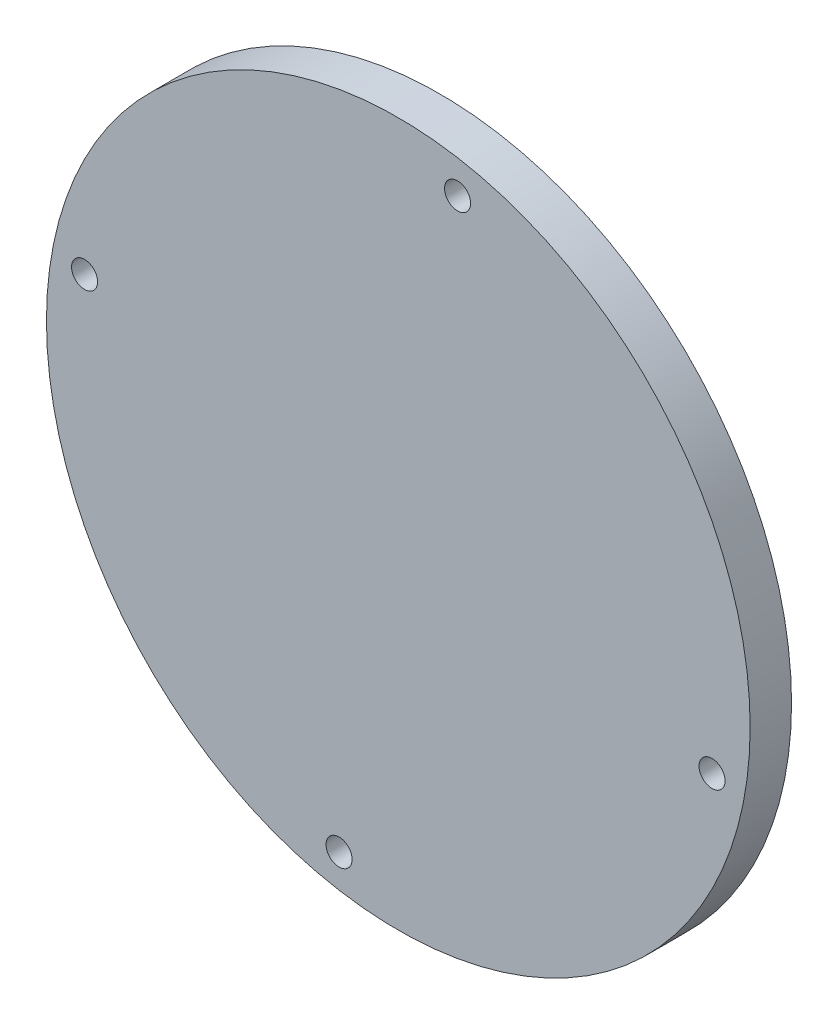
ISO-10303-21;
HEADER;
FILE_DESCRIPTION(('STEP AP214'),'2;1');
FILE_NAME('part.step','',(''),(''),'','','');
FILE_SCHEMA(('AUTOMOTIVE_DESIGN { 1 0 10303 214 1 1 1 1 }'));
ENDSEC;
DATA;
#1=APPLICATION_CONTEXT('core data for automotive mechanical design processes');
#2=APPLICATION_PROTOCOL_DEFINITION('international standard','automotive_design',2000,#1);
#3=PRODUCT_CONTEXT('',#1,'mechanical');
#4=PRODUCT('Part','Part','',(#3));
#5=PRODUCT_RELATED_PRODUCT_CATEGORY('part','',(#4));
#6=PRODUCT_DEFINITION_FORMATION('','',#4);
#7=PRODUCT_DEFINITION_CONTEXT('part definition',#1,'design');
#8=PRODUCT_DEFINITION('design','',#6,#7);
#9=PRODUCT_DEFINITION_SHAPE('','',#8);
#10=(LENGTH_UNIT() NAMED_UNIT(*) SI_UNIT(.MILLI.,.METRE.));
#11=(NAMED_UNIT(*) PLANE_ANGLE_UNIT() SI_UNIT($,.RADIAN.));
#12=(NAMED_UNIT(*) SI_UNIT($,.STERADIAN.) SOLID_ANGLE_UNIT());
#13=UNCERTAINTY_MEASURE_WITH_UNIT(LENGTH_MEASURE(1.E-05),#10,'distance_accuracy_value','');
#14=(GEOMETRIC_REPRESENTATION_CONTEXT(3) GLOBAL_UNCERTAINTY_ASSIGNED_CONTEXT((#13)) GLOBAL_UNIT_ASSIGNED_CONTEXT((#10,
#11,#12)) REPRESENTATION_CONTEXT('',''));
#15=CARTESIAN_POINT('',(0.,0.,0.));
#16=DIRECTION('',(0.,0.,1.));
#17=DIRECTION('',(1.,0.,0.));
#18=AXIS2_PLACEMENT_3D('',#15,#16,#17);
#19=CARTESIAN_POINT('',(0.,0.,0.));
#20=DIRECTION('',(0.,0.,1.));
#21=DIRECTION('',(1.,0.,0.));
#22=AXIS2_PLACEMENT_3D('',#19,#20,#21);
#23=PLANE('',#22);
#24=CARTESIAN_POINT('',(24.0747197736723,-4.54509271843326,0.));
#25=DIRECTION('',(0.,0.,-1.));
#26=DIRECTION('',(-1.,0.,0.));
#27=AXIS2_PLACEMENT_3D('',#24,#25,#26);
#28=CIRCLE('',#27,0.999999999999987);
#29=CARTESIAN_POINT('',(23.0747197736723,-4.54509271843326,0.));
#30=VERTEX_POINT('',#29);
#31=EDGE_CURVE('E64',#30,#30,#28,.T.);
#32=ORIENTED_EDGE('',*,*,#31,.F.);
#33=EDGE_LOOP('',(#32));
#34=FACE_BOUND('',#33,.T.);
#35=CARTESIAN_POINT('',(-4.54509271843349,-24.0747197736722,0.));
#36=DIRECTION('',(0.,0.,-1.));
#37=DIRECTION('',(-1.,0.,0.));
#38=AXIS2_PLACEMENT_3D('',#35,#36,#37);
#39=CIRCLE('',#38,0.999999999999987);
#40=CARTESIAN_POINT('',(-5.54509271843347,-24.0747197736722,0.));
#41=VERTEX_POINT('',#40);
#42=EDGE_CURVE('E58',#41,#41,#39,.T.);
#43=ORIENTED_EDGE('',*,*,#42,.F.);
#44=EDGE_LOOP('',(#43));
#45=FACE_BOUND('',#44,.T.);
#46=CARTESIAN_POINT('',(-24.0747197736722,4.54509271843324,0.));
#47=DIRECTION('',(0.,0.,-1.));
#48=DIRECTION('',(-1.,0.,0.));
#49=AXIS2_PLACEMENT_3D('',#46,#47,#48);
#50=CIRCLE('',#49,0.999999999999987);
#51=CARTESIAN_POINT('',(-25.0747197736722,4.54509271843324,0.));
#52=VERTEX_POINT('',#51);
#53=EDGE_CURVE('E52',#52,#52,#50,.T.);
#54=ORIENTED_EDGE('',*,*,#53,.F.);
#55=EDGE_LOOP('',(#54));
#56=FACE_BOUND('',#55,.T.);
#57=CARTESIAN_POINT('',(0.,0.,0.));
#58=DIRECTION('',(0.,0.,1.));
#59=DIRECTION('',(1.,0.,0.));
#60=AXIS2_PLACEMENT_3D('',#57,#58,#59);
#61=CIRCLE('',#60,27.);
#62=CARTESIAN_POINT('',(27.,0.,0.));
#63=VERTEX_POINT('',#62);
#64=EDGE_CURVE('E35',#63,#63,#61,.T.);
#65=ORIENTED_EDGE('',*,*,#64,.F.);
#66=EDGE_LOOP('',(#65));
#67=FACE_BOUND('',#66,.T.);
#68=CARTESIAN_POINT('',(4.54509271843334,24.0747197736722,0.));
#69=DIRECTION('',(0.,0.,-1.));
#70=DIRECTION('',(-1.,0.,0.));
#71=AXIS2_PLACEMENT_3D('',#68,#69,#70);
#72=CIRCLE('',#71,0.999999999999987);
#73=CARTESIAN_POINT('',(3.54509271843336,24.0747197736722,0.));
#74=VERTEX_POINT('',#73);
#75=EDGE_CURVE('E46',#74,#74,#72,.T.);
#76=ORIENTED_EDGE('',*,*,#75,.F.);
#77=EDGE_LOOP('',(#76));
#78=FACE_BOUND('',#77,.T.);
#79=ADVANCED_FACE('F31',(#34,#45,#56,#67,#78),#23,.F.);
#80=CARTESIAN_POINT('',(0.,0.,3.175));
#81=DIRECTION('',(0.,0.,-1.));
#82=DIRECTION('',(-1.,0.,0.));
#83=AXIS2_PLACEMENT_3D('',#80,#81,#82);
#84=CYLINDRICAL_SURFACE('',#83,27.);
#85=CARTESIAN_POINT('',(0.,0.,3.175));
#86=DIRECTION('',(0.,0.,1.));
#87=DIRECTION('',(1.,0.,0.));
#88=AXIS2_PLACEMENT_3D('',#85,#86,#87);
#89=CIRCLE('',#88,27.);
#90=CARTESIAN_POINT('',(27.,0.,3.175));
#91=VERTEX_POINT('',#90);
#92=EDGE_CURVE('E10',#91,#91,#89,.T.);
#93=ORIENTED_EDGE('',*,*,#92,.F.);
#94=EDGE_LOOP('',(#93));
#95=FACE_BOUND('',#94,.T.);
#96=ORIENTED_EDGE('',*,*,#64,.T.);
#97=EDGE_LOOP('',(#96));
#98=FACE_BOUND('',#97,.T.);
#99=ADVANCED_FACE('F33',(#95,#98),#84,.T.);
#100=CARTESIAN_POINT('',(0.,0.,3.175));
#101=DIRECTION('',(0.,0.,1.));
#102=DIRECTION('',(1.,0.,0.));
#103=AXIS2_PLACEMENT_3D('',#100,#101,#102);
#104=PLANE('',#103);
#105=CARTESIAN_POINT('',(24.0747197736723,-4.54509271843326,3.175));
#106=DIRECTION('',(0.,0.,-1.));
#107=DIRECTION('',(-1.,0.,0.));
#108=AXIS2_PLACEMENT_3D('',#105,#106,#107);
#109=CIRCLE('',#108,0.999999999999997);
#110=CARTESIAN_POINT('',(23.0747197736723,-4.54509271843326,3.175));
#111=VERTEX_POINT('',#110);
#112=EDGE_CURVE('E61',#111,#111,#109,.T.);
#113=ORIENTED_EDGE('',*,*,#112,.T.);
#114=EDGE_LOOP('',(#113));
#115=FACE_BOUND('',#114,.T.);
#116=CARTESIAN_POINT('',(-4.54509271843349,-24.0747197736722,3.175));
#117=DIRECTION('',(0.,0.,-1.));
#118=DIRECTION('',(-1.,0.,0.));
#119=AXIS2_PLACEMENT_3D('',#116,#117,#118);
#120=CIRCLE('',#119,0.999999999999998);
#121=CARTESIAN_POINT('',(-5.54509271843348,-24.0747197736722,3.175));
#122=VERTEX_POINT('',#121);
#123=EDGE_CURVE('E55',#122,#122,#120,.T.);
#124=ORIENTED_EDGE('',*,*,#123,.T.);
#125=EDGE_LOOP('',(#124));
#126=FACE_BOUND('',#125,.T.);
#127=CARTESIAN_POINT('',(-24.0747197736722,4.54509271843324,3.175));
#128=DIRECTION('',(0.,0.,-1.));
#129=DIRECTION('',(-1.,0.,0.));
#130=AXIS2_PLACEMENT_3D('',#127,#128,#129);
#131=CIRCLE('',#130,0.999999999999997);
#132=CARTESIAN_POINT('',(-25.0747197736722,4.54509271843324,3.175));
#133=VERTEX_POINT('',#132);
#134=EDGE_CURVE('E49',#133,#133,#131,.T.);
#135=ORIENTED_EDGE('',*,*,#134,.T.);
#136=EDGE_LOOP('',(#135));
#137=FACE_BOUND('',#136,.T.);
#138=CARTESIAN_POINT('',(4.54509271843334,24.0747197736722,3.175));
#139=DIRECTION('',(0.,0.,-1.));
#140=DIRECTION('',(-1.,0.,0.));
#141=AXIS2_PLACEMENT_3D('',#138,#139,#140);
#142=CIRCLE('',#141,0.999999999999997);
#143=CARTESIAN_POINT('',(3.54509271843335,24.0747197736722,3.175));
#144=VERTEX_POINT('',#143);
#145=EDGE_CURVE('E42',#144,#144,#142,.T.);
#146=ORIENTED_EDGE('',*,*,#145,.T.);
#147=EDGE_LOOP('',(#146));
#148=FACE_BOUND('',#147,.T.);
#149=ORIENTED_EDGE('',*,*,#92,.T.);
#150=EDGE_LOOP('',(#149));
#151=FACE_BOUND('',#150,.T.);
#152=ADVANCED_FACE('F83',(#115,#126,#137,#148,#151),#104,.T.);
#153=CARTESIAN_POINT('',(4.54509271843334,24.0747197736722,0.));
#154=DIRECTION('',(0.,0.,-1.));
#155=DIRECTION('',(-1.,0.,0.));
#156=AXIS2_PLACEMENT_3D('',#153,#154,#155);
#157=CYLINDRICAL_SURFACE('',#156,0.999999999999992);
#158=ORIENTED_EDGE('',*,*,#145,.F.);
#159=EDGE_LOOP('',(#158));
#160=FACE_BOUND('',#159,.T.);
#161=ORIENTED_EDGE('',*,*,#75,.T.);
#162=EDGE_LOOP('',(#161));
#163=FACE_BOUND('',#162,.T.);
#164=ADVANCED_FACE('F80',(#160,#163),#157,.F.);
#165=CARTESIAN_POINT('',(-24.0747197736722,4.54509271843324,0.));
#166=DIRECTION('',(0.,0.,-1.));
#167=DIRECTION('',(-1.,0.,0.));
#168=AXIS2_PLACEMENT_3D('',#165,#166,#167);
#169=CYLINDRICAL_SURFACE('',#168,0.999999999999992);
#170=ORIENTED_EDGE('',*,*,#134,.F.);
#171=EDGE_LOOP('',(#170));
#172=FACE_BOUND('',#171,.T.);
#173=ORIENTED_EDGE('',*,*,#53,.T.);
#174=EDGE_LOOP('',(#173));
#175=FACE_BOUND('',#174,.T.);
#176=ADVANCED_FACE('F82',(#172,#175),#169,.F.);
#177=CARTESIAN_POINT('',(-4.54509271843349,-24.0747197736722,0.));
#178=DIRECTION('',(0.,0.,-1.));
#179=DIRECTION('',(-1.,0.,0.));
#180=AXIS2_PLACEMENT_3D('',#177,#178,#179);
#181=CYLINDRICAL_SURFACE('',#180,0.999999999999992);
#182=ORIENTED_EDGE('',*,*,#123,.F.);
#183=EDGE_LOOP('',(#182));
#184=FACE_BOUND('',#183,.T.);
#185=ORIENTED_EDGE('',*,*,#42,.T.);
#186=EDGE_LOOP('',(#185));
#187=FACE_BOUND('',#186,.T.);
#188=ADVANCED_FACE('F90',(#184,#187),#181,.F.);
#189=CARTESIAN_POINT('',(24.0747197736723,-4.54509271843326,0.));
#190=DIRECTION('',(0.,0.,-1.));
#191=DIRECTION('',(-1.,0.,0.));
#192=AXIS2_PLACEMENT_3D('',#189,#190,#191);
#193=CYLINDRICAL_SURFACE('',#192,0.999999999999992);
#194=ORIENTED_EDGE('',*,*,#112,.F.);
#195=EDGE_LOOP('',(#194));
#196=FACE_BOUND('',#195,.T.);
#197=ORIENTED_EDGE('',*,*,#31,.T.);
#198=EDGE_LOOP('',(#197));
#199=FACE_BOUND('',#198,.T.);
#200=ADVANCED_FACE('F68',(#196,#199),#193,.F.);
#201=CLOSED_SHELL('',(#79,#99,#152,#164,#176,#188,#200));
#202=MANIFOLD_SOLID_BREP('B2',#201);
#203=ADVANCED_BREP_SHAPE_REPRESENTATION('',(#18,#202),#14);
#204=SHAPE_DEFINITION_REPRESENTATION(#9,#203);
ENDSEC;
END-ISO-10303-21;
